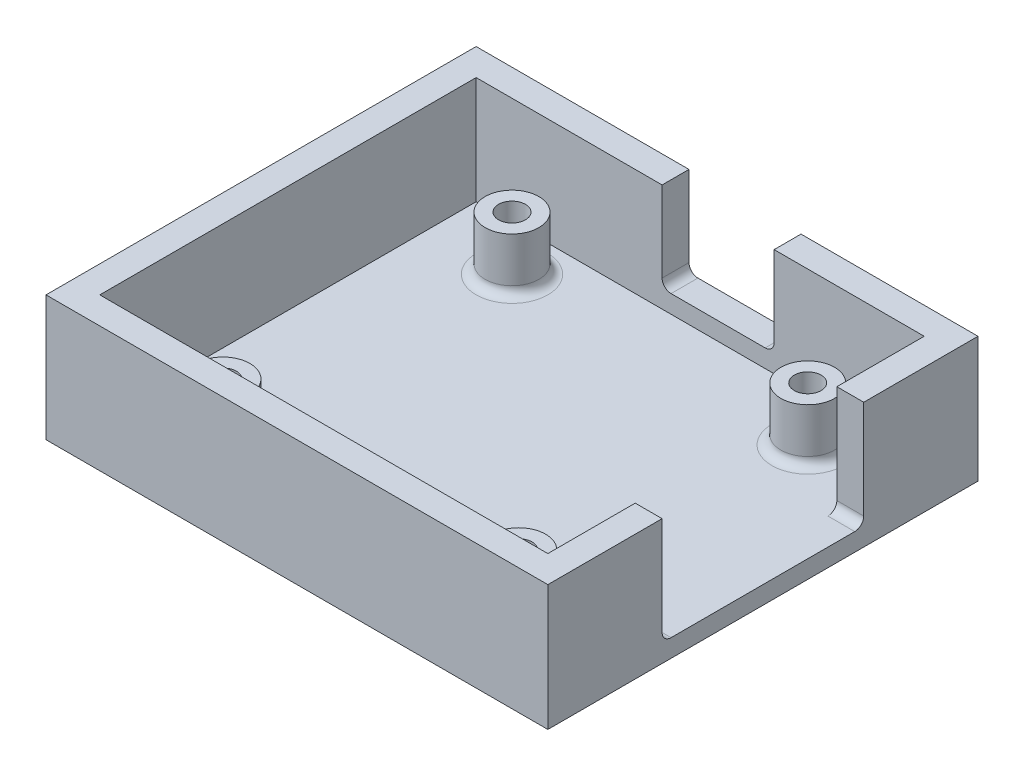
ISO-10303-21;
HEADER;
FILE_DESCRIPTION(('STEP AP214'),'2;1');
FILE_NAME('part.step','',(''),(''),'','','');
FILE_SCHEMA(('AUTOMOTIVE_DESIGN { 1 0 10303 214 1 1 1 1 }'));
ENDSEC;
DATA;
#1=APPLICATION_CONTEXT('core data for automotive mechanical design processes');
#2=APPLICATION_PROTOCOL_DEFINITION('international standard','automotive_design',2000,#1);
#3=PRODUCT_CONTEXT('',#1,'mechanical');
#4=PRODUCT('Part','Part','',(#3));
#5=PRODUCT_RELATED_PRODUCT_CATEGORY('part','',(#4));
#6=PRODUCT_DEFINITION_FORMATION('','',#4);
#7=PRODUCT_DEFINITION_CONTEXT('part definition',#1,'design');
#8=PRODUCT_DEFINITION('design','',#6,#7);
#9=PRODUCT_DEFINITION_SHAPE('','',#8);
#10=(LENGTH_UNIT() NAMED_UNIT(*) SI_UNIT(.MILLI.,.METRE.));
#11=(NAMED_UNIT(*) PLANE_ANGLE_UNIT() SI_UNIT($,.RADIAN.));
#12=(NAMED_UNIT(*) SI_UNIT($,.STERADIAN.) SOLID_ANGLE_UNIT());
#13=UNCERTAINTY_MEASURE_WITH_UNIT(LENGTH_MEASURE(1.E-05),#10,'distance_accuracy_value','');
#14=(GEOMETRIC_REPRESENTATION_CONTEXT(3) GLOBAL_UNCERTAINTY_ASSIGNED_CONTEXT((#13)) GLOBAL_UNIT_ASSIGNED_CONTEXT((#10,
#11,#12)) REPRESENTATION_CONTEXT('',''));
#15=CARTESIAN_POINT('',(0.,0.,0.));
#16=DIRECTION('',(0.,0.,1.));
#17=DIRECTION('',(1.,0.,0.));
#18=AXIS2_PLACEMENT_3D('',#15,#16,#17);
#19=CARTESIAN_POINT('',(0.,14.,0.));
#20=DIRECTION('',(0.,1.,0.));
#21=DIRECTION('',(0.,0.,1.));
#22=AXIS2_PLACEMENT_3D('',#19,#20,#21);
#23=PLANE('',#22);
#24=DIRECTION('',(0.,0.,1.));
#25=VECTOR('',#24,1.);
#26=CARTESIAN_POINT('',(3.67964824120601,14.,-39.5002729051399));
#27=LINE('',#26,#25);
#28=CARTESIAN_POINT('',(3.67964824120601,14.,-23.4924623115578));
#29=VERTEX_POINT('',#28);
#30=CARTESIAN_POINT('',(3.67964824120601,14.,-20.4924623115578));
#31=VERTEX_POINT('',#30);
#32=EDGE_CURVE('E207',#29,#31,#27,.T.);
#33=ORIENTED_EDGE('',*,*,#32,.F.);
#34=DIRECTION('',(-1.,0.,0.));
#35=VECTOR('',#34,1.);
#36=CARTESIAN_POINT('',(-20.070351758794,14.,-23.4924623115578));
#37=LINE('',#36,#35);
#38=CARTESIAN_POINT('',(-20.070351758794,14.,-23.4924623115578));
#39=VERTEX_POINT('',#38);
#40=EDGE_CURVE('E256',#29,#39,#37,.T.);
#41=ORIENTED_EDGE('',*,*,#40,.T.);
#42=DIRECTION('',(0.,0.,1.));
#43=VECTOR('',#42,1.);
#44=CARTESIAN_POINT('',(-20.070351758794,14.,-23.4924623115578));
#45=LINE('',#44,#43);
#46=CARTESIAN_POINT('',(-20.070351758794,14.,24.5075376884422));
#47=VERTEX_POINT('',#46);
#48=EDGE_CURVE('E243',#39,#47,#45,.T.);
#49=ORIENTED_EDGE('',*,*,#48,.T.);
#50=DIRECTION('',(1.,0.,0.));
#51=VECTOR('',#50,1.);
#52=CARTESIAN_POINT('',(-20.070351758794,14.,24.5075376884422));
#53=LINE('',#52,#51);
#54=CARTESIAN_POINT('',(35.929648241206,14.,24.5075376884422));
#55=VERTEX_POINT('',#54);
#56=EDGE_CURVE('E247',#47,#55,#53,.T.);
#57=ORIENTED_EDGE('',*,*,#56,.T.);
#58=DIRECTION('',(0.,0.,-1.));
#59=VECTOR('',#58,1.);
#60=CARTESIAN_POINT('',(35.929648241206,14.,-23.4924623115578));
#61=LINE('',#60,#59);
#62=CARTESIAN_POINT('',(35.929648241206,14.,11.7575376884422));
#63=VERTEX_POINT('',#62);
#64=EDGE_CURVE('E252',#55,#63,#61,.T.);
#65=ORIENTED_EDGE('',*,*,#64,.T.);
#66=DIRECTION('',(-1.,0.,0.));
#67=VECTOR('',#66,1.);
#68=CARTESIAN_POINT('',(61.429648241206,14.,11.7575376884422));
#69=LINE('',#68,#67);
#70=CARTESIAN_POINT('',(32.929648241206,14.,11.7575376884422));
#71=VERTEX_POINT('',#70);
#72=EDGE_CURVE('E503',#63,#71,#69,.T.);
#73=ORIENTED_EDGE('',*,*,#72,.T.);
#74=DIRECTION('',(0.,0.,-1.));
#75=VECTOR('',#74,1.);
#76=CARTESIAN_POINT('',(32.929648241206,14.,-20.4924623115578));
#77=LINE('',#76,#75);
#78=CARTESIAN_POINT('',(32.929648241206,14.,21.5075376884422));
#79=VERTEX_POINT('',#78);
#80=EDGE_CURVE('E224',#79,#71,#77,.T.);
#81=ORIENTED_EDGE('',*,*,#80,.F.);
#82=DIRECTION('',(1.,0.,0.));
#83=VECTOR('',#82,1.);
#84=CARTESIAN_POINT('',(-17.070351758794,14.,21.5075376884422));
#85=LINE('',#84,#83);
#86=CARTESIAN_POINT('',(-17.070351758794,14.,21.5075376884422));
#87=VERTEX_POINT('',#86);
#88=EDGE_CURVE('E471',#87,#79,#85,.T.);
#89=ORIENTED_EDGE('',*,*,#88,.F.);
#90=DIRECTION('',(0.,0.,1.));
#91=VECTOR('',#90,1.);
#92=CARTESIAN_POINT('',(-17.070351758794,14.,-20.4924623115578));
#93=LINE('',#92,#91);
#94=CARTESIAN_POINT('',(-17.070351758794,14.,-20.4924623115578));
#95=VERTEX_POINT('',#94);
#96=EDGE_CURVE('E466',#95,#87,#93,.T.);
#97=ORIENTED_EDGE('',*,*,#96,.F.);
#98=DIRECTION('',(-1.,0.,0.));
#99=VECTOR('',#98,1.);
#100=CARTESIAN_POINT('',(-17.070351758794,14.,-20.4924623115578));
#101=LINE('',#100,#99);
#102=EDGE_CURVE('E217',#31,#95,#101,.T.);
#103=ORIENTED_EDGE('',*,*,#102,.F.);
#104=EDGE_LOOP('',(#33,#41,#49,#57,#65,#73,#81,#89,#97,#103));
#105=FACE_BOUND('',#104,.T.);
#106=ADVANCED_FACE('F43',(#105),#23,.T.);
#107=CARTESIAN_POINT('',(32.929648241206,2.,-20.4924623115578));
#108=DIRECTION('',(1.,0.,0.));
#109=DIRECTION('',(0.,0.,-1.));
#110=AXIS2_PLACEMENT_3D('',#107,#108,#109);
#111=PLANE('',#110);
#112=DIRECTION('',(0.,0.,-1.));
#113=VECTOR('',#112,1.);
#114=CARTESIAN_POINT('',(32.929648241206,2.,-20.4924623115578));
#115=LINE('',#114,#113);
#116=CARTESIAN_POINT('',(32.929648241206,2.,-9.74246231155779));
#117=VERTEX_POINT('',#116);
#118=CARTESIAN_POINT('',(32.929648241206,2.,-20.4924623115578));
#119=VERTEX_POINT('',#118);
#120=EDGE_CURVE('E481',#117,#119,#115,.T.);
#121=ORIENTED_EDGE('',*,*,#120,.F.);
#122=CARTESIAN_POINT('',(32.929648241206,3.,-9.74246231155779));
#123=DIRECTION('',(1.,0.,0.));
#124=DIRECTION('',(0.,0.,-1.));
#125=AXIS2_PLACEMENT_3D('',#122,#123,#124);
#126=CIRCLE('',#125,1.);
#127=CARTESIAN_POINT('',(32.929648241206,3.,-10.7424623115578));
#128=VERTEX_POINT('',#127);
#129=EDGE_CURVE('E339',#117,#128,#126,.T.);
#130=ORIENTED_EDGE('',*,*,#129,.T.);
#131=DIRECTION('',(0.,-1.,0.));
#132=VECTOR('',#131,1.);
#133=CARTESIAN_POINT('',(32.929648241206,14.,-10.7424623115578));
#134=LINE('',#133,#132);
#135=CARTESIAN_POINT('',(32.929648241206,14.,-10.7424623115578));
#136=VERTEX_POINT('',#135);
#137=EDGE_CURVE('E513',#136,#128,#134,.T.);
#138=ORIENTED_EDGE('',*,*,#137,.F.);
#139=CARTESIAN_POINT('',(32.929648241206,14.,-20.4924623115578));
#140=VERTEX_POINT('',#139);
#141=EDGE_CURVE('E489',#136,#140,#77,.T.);
#142=ORIENTED_EDGE('',*,*,#141,.T.);
#143=DIRECTION('',(0.,1.,0.));
#144=VECTOR('',#143,1.);
#145=CARTESIAN_POINT('',(32.929648241206,2.,-20.4924623115578));
#146=LINE('',#145,#144);
#147=EDGE_CURVE('E214',#119,#140,#146,.T.);
#148=ORIENTED_EDGE('',*,*,#147,.F.);
#149=EDGE_LOOP('',(#121,#130,#138,#142,#148));
#150=FACE_BOUND('',#149,.T.);
#151=ADVANCED_FACE('F393',(#150),#111,.F.);
#152=CARTESIAN_POINT('',(-20.070351758794,14.,-23.4924623115578));
#153=DIRECTION('',(1.,0.,0.));
#154=DIRECTION('',(0.,0.,-1.));
#155=AXIS2_PLACEMENT_3D('',#152,#153,#154);
#156=PLANE('',#155);
#157=DIRECTION('',(0.,0.,1.));
#158=VECTOR('',#157,1.);
#159=CARTESIAN_POINT('',(-20.070351758794,0.,-23.4924623115578));
#160=LINE('',#159,#158);
#161=CARTESIAN_POINT('',(-20.070351758794,0.,-23.4924623115578));
#162=VERTEX_POINT('',#161);
#163=CARTESIAN_POINT('',(-20.070351758794,0.,24.5075376884422));
#164=VERTEX_POINT('',#163);
#165=EDGE_CURVE('E232',#162,#164,#160,.T.);
#166=ORIENTED_EDGE('',*,*,#165,.T.);
#167=DIRECTION('',(0.,-1.,0.));
#168=VECTOR('',#167,1.);
#169=CARTESIAN_POINT('',(-20.070351758794,14.,24.5075376884422));
#170=LINE('',#169,#168);
#171=EDGE_CURVE('E282',#47,#164,#170,.T.);
#172=ORIENTED_EDGE('',*,*,#171,.F.);
#173=ORIENTED_EDGE('',*,*,#48,.F.);
#174=DIRECTION('',(0.,-1.,0.));
#175=VECTOR('',#174,1.);
#176=CARTESIAN_POINT('',(-20.070351758794,14.,-23.4924623115578));
#177=LINE('',#176,#175);
#178=EDGE_CURVE('E259',#39,#162,#177,.T.);
#179=ORIENTED_EDGE('',*,*,#178,.T.);
#180=EDGE_LOOP('',(#166,#172,#173,#179));
#181=FACE_BOUND('',#180,.T.);
#182=ADVANCED_FACE('F399',(#181),#156,.F.);
#183=CARTESIAN_POINT('',(-20.070351758794,14.,24.5075376884422));
#184=DIRECTION('',(0.,0.,-1.));
#185=DIRECTION('',(-1.,0.,0.));
#186=AXIS2_PLACEMENT_3D('',#183,#184,#185);
#187=PLANE('',#186);
#188=DIRECTION('',(1.,0.,0.));
#189=VECTOR('',#188,1.);
#190=CARTESIAN_POINT('',(-20.070351758794,0.,24.5075376884422));
#191=LINE('',#190,#189);
#192=CARTESIAN_POINT('',(35.929648241206,0.,24.5075376884422));
#193=VERTEX_POINT('',#192);
#194=EDGE_CURVE('E263',#164,#193,#191,.T.);
#195=ORIENTED_EDGE('',*,*,#194,.T.);
#196=DIRECTION('',(0.,-1.,0.));
#197=VECTOR('',#196,1.);
#198=CARTESIAN_POINT('',(35.929648241206,14.,24.5075376884422));
#199=LINE('',#198,#197);
#200=EDGE_CURVE('E278',#55,#193,#199,.T.);
#201=ORIENTED_EDGE('',*,*,#200,.F.);
#202=ORIENTED_EDGE('',*,*,#56,.F.);
#203=ORIENTED_EDGE('',*,*,#171,.T.);
#204=EDGE_LOOP('',(#195,#201,#202,#203));
#205=FACE_BOUND('',#204,.T.);
#206=ADVANCED_FACE('F421',(#205),#187,.F.);
#207=CARTESIAN_POINT('',(35.929648241206,14.,-23.4924623115578));
#208=DIRECTION('',(-1.,0.,0.));
#209=DIRECTION('',(0.,0.,1.));
#210=AXIS2_PLACEMENT_3D('',#207,#208,#209);
#211=PLANE('',#210);
#212=CARTESIAN_POINT('',(35.929648241206,14.,-10.7424623115578));
#213=VERTEX_POINT('',#212);
#214=CARTESIAN_POINT('',(35.929648241206,14.,-23.4924623115578));
#215=VERTEX_POINT('',#214);
#216=EDGE_CURVE('E251',#213,#215,#61,.T.);
#217=ORIENTED_EDGE('',*,*,#216,.F.);
#218=DIRECTION('',(0.,1.,0.));
#219=VECTOR('',#218,1.);
#220=CARTESIAN_POINT('',(35.929648241206,14.,-10.7424623115578));
#221=LINE('',#220,#219);
#222=CARTESIAN_POINT('',(35.929648241206,3.,-10.7424623115578));
#223=VERTEX_POINT('',#222);
#224=EDGE_CURVE('E521',#223,#213,#221,.T.);
#225=ORIENTED_EDGE('',*,*,#224,.F.);
#226=CARTESIAN_POINT('',(35.929648241206,3.,-9.74246231155779));
#227=DIRECTION('',(-1.,0.,0.));
#228=DIRECTION('',(0.,0.,1.));
#229=AXIS2_PLACEMENT_3D('',#226,#227,#228);
#230=CIRCLE('',#229,1.);
#231=CARTESIAN_POINT('',(35.929648241206,2.,-9.74246231155779));
#232=VERTEX_POINT('',#231);
#233=EDGE_CURVE('E342',#223,#232,#230,.T.);
#234=ORIENTED_EDGE('',*,*,#233,.T.);
#235=DIRECTION('',(0.,0.,-1.));
#236=VECTOR('',#235,1.);
#237=CARTESIAN_POINT('',(35.929648241206,2.,-10.7424623115578));
#238=LINE('',#237,#236);
#239=CARTESIAN_POINT('',(35.929648241206,2.,10.7575376884422));
#240=VERTEX_POINT('',#239);
#241=EDGE_CURVE('E516',#240,#232,#238,.T.);
#242=ORIENTED_EDGE('',*,*,#241,.F.);
#243=CARTESIAN_POINT('',(35.929648241206,3.,10.7575376884422));
#244=DIRECTION('',(-1.,0.,0.));
#245=DIRECTION('',(0.,0.,1.));
#246=AXIS2_PLACEMENT_3D('',#243,#244,#245);
#247=CIRCLE('',#246,1.);
#248=CARTESIAN_POINT('',(35.929648241206,3.,11.7575376884422));
#249=VERTEX_POINT('',#248);
#250=EDGE_CURVE('E67',#240,#249,#247,.T.);
#251=ORIENTED_EDGE('',*,*,#250,.T.);
#252=DIRECTION('',(0.,-1.,0.));
#253=VECTOR('',#252,1.);
#254=CARTESIAN_POINT('',(35.929648241206,14.,11.7575376884422));
#255=LINE('',#254,#253);
#256=EDGE_CURVE('E511',#63,#249,#255,.T.);
#257=ORIENTED_EDGE('',*,*,#256,.F.);
#258=ORIENTED_EDGE('',*,*,#64,.F.);
#259=ORIENTED_EDGE('',*,*,#200,.T.);
#260=DIRECTION('',(0.,0.,-1.));
#261=VECTOR('',#260,1.);
#262=CARTESIAN_POINT('',(35.929648241206,0.,-23.4924623115578));
#263=LINE('',#262,#261);
#264=CARTESIAN_POINT('',(35.929648241206,0.,-23.4924623115578));
#265=VERTEX_POINT('',#264);
#266=EDGE_CURVE('E266',#193,#265,#263,.T.);
#267=ORIENTED_EDGE('',*,*,#266,.T.);
#268=DIRECTION('',(0.,-1.,0.));
#269=VECTOR('',#268,1.);
#270=CARTESIAN_POINT('',(35.929648241206,14.,-23.4924623115578));
#271=LINE('',#270,#269);
#272=EDGE_CURVE('E274',#215,#265,#271,.T.);
#273=ORIENTED_EDGE('',*,*,#272,.F.);
#274=EDGE_LOOP('',(#217,#225,#234,#242,#251,#257,#258,#259,#267,#273));
#275=FACE_BOUND('',#274,.T.);
#276=ADVANCED_FACE('F415',(#275),#211,.F.);
#277=CARTESIAN_POINT('',(-20.070351758794,14.,-23.4924623115578));
#278=DIRECTION('',(0.,0.,1.));
#279=DIRECTION('',(1.,0.,0.));
#280=AXIS2_PLACEMENT_3D('',#277,#278,#279);
#281=PLANE('',#280);
#282=ORIENTED_EDGE('',*,*,#40,.F.);
#283=DIRECTION('',(0.,1.,0.));
#284=VECTOR('',#283,1.);
#285=CARTESIAN_POINT('',(3.67964824120601,14.,-23.4924623115578));
#286=LINE('',#285,#284);
#287=CARTESIAN_POINT('',(3.67964824120601,5.,-23.4924623115578));
#288=VERTEX_POINT('',#287);
#289=EDGE_CURVE('E594',#288,#29,#286,.T.);
#290=ORIENTED_EDGE('',*,*,#289,.F.);
#291=CARTESIAN_POINT('',(4.67964824120601,5.,-23.4924623115578));
#292=DIRECTION('',(0.,0.,1.));
#293=DIRECTION('',(1.,0.,0.));
#294=AXIS2_PLACEMENT_3D('',#291,#292,#293);
#295=CIRCLE('',#294,1.);
#296=CARTESIAN_POINT('',(4.67964824120601,4.,-23.4924623115578));
#297=VERTEX_POINT('',#296);
#298=EDGE_CURVE('E336',#288,#297,#295,.T.);
#299=ORIENTED_EDGE('',*,*,#298,.T.);
#300=DIRECTION('',(-1.,0.,0.));
#301=VECTOR('',#300,1.);
#302=CARTESIAN_POINT('',(3.67964824120601,4.,-23.4924623115578));
#303=LINE('',#302,#301);
#304=CARTESIAN_POINT('',(15.179648241206,4.,-23.4924623115578));
#305=VERTEX_POINT('',#304);
#306=EDGE_CURVE('E611',#305,#297,#303,.T.);
#307=ORIENTED_EDGE('',*,*,#306,.F.);
#308=CARTESIAN_POINT('',(15.179648241206,5.,-23.4924623115578));
#309=DIRECTION('',(0.,0.,1.));
#310=DIRECTION('',(1.,0.,0.));
#311=AXIS2_PLACEMENT_3D('',#308,#309,#310);
#312=CIRCLE('',#311,1.);
#313=CARTESIAN_POINT('',(16.179648241206,5.,-23.4924623115578));
#314=VERTEX_POINT('',#313);
#315=EDGE_CURVE('E330',#305,#314,#312,.T.);
#316=ORIENTED_EDGE('',*,*,#315,.T.);
#317=DIRECTION('',(0.,-1.,0.));
#318=VECTOR('',#317,1.);
#319=CARTESIAN_POINT('',(16.179648241206,14.,-23.4924623115578));
#320=LINE('',#319,#318);
#321=CARTESIAN_POINT('',(16.179648241206,14.,-23.4924623115578));
#322=VERTEX_POINT('',#321);
#323=EDGE_CURVE('E591',#322,#314,#320,.T.);
#324=ORIENTED_EDGE('',*,*,#323,.F.);
#325=EDGE_CURVE('E205',#215,#322,#37,.T.);
#326=ORIENTED_EDGE('',*,*,#325,.F.);
#327=ORIENTED_EDGE('',*,*,#272,.T.);
#328=DIRECTION('',(-1.,0.,0.));
#329=VECTOR('',#328,1.);
#330=CARTESIAN_POINT('',(-20.070351758794,0.,-23.4924623115578));
#331=LINE('',#330,#329);
#332=EDGE_CURVE('E248',#265,#162,#331,.T.);
#333=ORIENTED_EDGE('',*,*,#332,.T.);
#334=ORIENTED_EDGE('',*,*,#178,.F.);
#335=EDGE_LOOP('',(#282,#290,#299,#307,#316,#324,#326,#327,#333,#334));
#336=FACE_BOUND('',#335,.T.);
#337=ADVANCED_FACE('F408',(#336),#281,.F.);
#338=DIRECTION('',(0.,0.,1.));
#339=VECTOR('',#338,1.);
#340=CARTESIAN_POINT('',(16.179648241206,14.,-39.5002729051399));
#341=LINE('',#340,#339);
#342=CARTESIAN_POINT('',(16.179648241206,14.,-20.4924623115578));
#343=VERTEX_POINT('',#342);
#344=EDGE_CURVE('E189',#322,#343,#341,.T.);
#345=ORIENTED_EDGE('',*,*,#344,.T.);
#346=EDGE_CURVE('E203',#140,#343,#101,.T.);
#347=ORIENTED_EDGE('',*,*,#346,.F.);
#348=ORIENTED_EDGE('',*,*,#141,.F.);
#349=DIRECTION('',(-1.,0.,0.));
#350=VECTOR('',#349,1.);
#351=CARTESIAN_POINT('',(61.429648241206,14.,-10.7424623115578));
#352=LINE('',#351,#350);
#353=EDGE_CURVE('E507',#213,#136,#352,.T.);
#354=ORIENTED_EDGE('',*,*,#353,.F.);
#355=ORIENTED_EDGE('',*,*,#216,.T.);
#356=ORIENTED_EDGE('',*,*,#325,.T.);
#357=EDGE_LOOP('',(#345,#347,#348,#354,#355,#356));
#358=FACE_BOUND('',#357,.T.);
#359=ADVANCED_FACE('F201',(#358),#23,.T.);
#360=CARTESIAN_POINT('',(0.,0.,0.));
#361=DIRECTION('',(0.,1.,0.));
#362=DIRECTION('',(0.,0.,1.));
#363=AXIS2_PLACEMENT_3D('',#360,#361,#362);
#364=PLANE('',#363);
#365=ORIENTED_EDGE('',*,*,#165,.F.);
#366=ORIENTED_EDGE('',*,*,#332,.F.);
#367=ORIENTED_EDGE('',*,*,#266,.F.);
#368=ORIENTED_EDGE('',*,*,#194,.F.);
#369=EDGE_LOOP('',(#365,#366,#367,#368));
#370=FACE_BOUND('',#369,.T.);
#371=ADVANCED_FACE('F407',(#370),#364,.F.);
#372=CARTESIAN_POINT('',(-17.070351758794,2.,-20.4924623115578));
#373=DIRECTION('',(-1.,0.,0.));
#374=DIRECTION('',(0.,0.,1.));
#375=AXIS2_PLACEMENT_3D('',#372,#373,#374);
#376=PLANE('',#375);
#377=ORIENTED_EDGE('',*,*,#96,.T.);
#378=DIRECTION('',(0.,1.,0.));
#379=VECTOR('',#378,1.);
#380=CARTESIAN_POINT('',(-17.070351758794,2.,21.5075376884422));
#381=LINE('',#380,#379);
#382=CARTESIAN_POINT('',(-17.070351758794,2.,21.5075376884422));
#383=VERTEX_POINT('',#382);
#384=EDGE_CURVE('E238',#383,#87,#381,.T.);
#385=ORIENTED_EDGE('',*,*,#384,.F.);
#386=DIRECTION('',(0.,0.,1.));
#387=VECTOR('',#386,1.);
#388=CARTESIAN_POINT('',(-17.070351758794,2.,-20.4924623115578));
#389=LINE('',#388,#387);
#390=CARTESIAN_POINT('',(-17.070351758794,2.,-20.4924623115578));
#391=VERTEX_POINT('',#390);
#392=EDGE_CURVE('E216',#391,#383,#389,.T.);
#393=ORIENTED_EDGE('',*,*,#392,.F.);
#394=DIRECTION('',(0.,1.,0.));
#395=VECTOR('',#394,1.);
#396=CARTESIAN_POINT('',(-17.070351758794,2.,-20.4924623115578));
#397=LINE('',#396,#395);
#398=EDGE_CURVE('E228',#391,#95,#397,.T.);
#399=ORIENTED_EDGE('',*,*,#398,.T.);
#400=EDGE_LOOP('',(#377,#385,#393,#399));
#401=FACE_BOUND('',#400,.T.);
#402=ADVANCED_FACE('F413',(#401),#376,.F.);
#403=CARTESIAN_POINT('',(-17.070351758794,2.,-20.4924623115578));
#404=DIRECTION('',(0.,0.,-1.));
#405=DIRECTION('',(-1.,0.,0.));
#406=AXIS2_PLACEMENT_3D('',#403,#404,#405);
#407=PLANE('',#406);
#408=DIRECTION('',(1.,0.,0.));
#409=VECTOR('',#408,1.);
#410=CARTESIAN_POINT('',(3.67964824120601,4.,-20.4924623115578));
#411=LINE('',#410,#409);
#412=CARTESIAN_POINT('',(4.67964824120601,4.,-20.4924623115578));
#413=VERTEX_POINT('',#412);
#414=CARTESIAN_POINT('',(15.179648241206,4.,-20.4924623115578));
#415=VERTEX_POINT('',#414);
#416=EDGE_CURVE('E196',#413,#415,#411,.T.);
#417=ORIENTED_EDGE('',*,*,#416,.F.);
#418=CARTESIAN_POINT('',(4.67964824120601,5.,-20.4924623115578));
#419=DIRECTION('',(0.,0.,-1.));
#420=DIRECTION('',(-1.,0.,0.));
#421=AXIS2_PLACEMENT_3D('',#418,#419,#420);
#422=CIRCLE('',#421,1.);
#423=CARTESIAN_POINT('',(3.67964824120601,5.,-20.4924623115578));
#424=VERTEX_POINT('',#423);
#425=EDGE_CURVE('E333',#413,#424,#422,.T.);
#426=ORIENTED_EDGE('',*,*,#425,.T.);
#427=DIRECTION('',(0.,-1.,0.));
#428=VECTOR('',#427,1.);
#429=CARTESIAN_POINT('',(3.67964824120601,14.,-20.4924623115578));
#430=LINE('',#429,#428);
#431=EDGE_CURVE('E587',#31,#424,#430,.T.);
#432=ORIENTED_EDGE('',*,*,#431,.F.);
#433=ORIENTED_EDGE('',*,*,#102,.T.);
#434=ORIENTED_EDGE('',*,*,#398,.F.);
#435=DIRECTION('',(-1.,0.,0.));
#436=VECTOR('',#435,1.);
#437=CARTESIAN_POINT('',(-17.070351758794,2.,-20.4924623115578));
#438=LINE('',#437,#436);
#439=EDGE_CURVE('E242',#119,#391,#438,.T.);
#440=ORIENTED_EDGE('',*,*,#439,.F.);
#441=ORIENTED_EDGE('',*,*,#147,.T.);
#442=ORIENTED_EDGE('',*,*,#346,.T.);
#443=DIRECTION('',(0.,1.,0.));
#444=VECTOR('',#443,1.);
#445=CARTESIAN_POINT('',(16.179648241206,14.,-20.4924623115578));
#446=LINE('',#445,#444);
#447=CARTESIAN_POINT('',(16.179648241206,5.,-20.4924623115578));
#448=VERTEX_POINT('',#447);
#449=EDGE_CURVE('E185',#448,#343,#446,.T.);
#450=ORIENTED_EDGE('',*,*,#449,.F.);
#451=CARTESIAN_POINT('',(15.179648241206,5.,-20.4924623115578));
#452=DIRECTION('',(0.,0.,-1.));
#453=DIRECTION('',(-1.,0.,0.));
#454=AXIS2_PLACEMENT_3D('',#451,#452,#453);
#455=CIRCLE('',#454,1.);
#456=EDGE_CURVE('E327',#448,#415,#455,.T.);
#457=ORIENTED_EDGE('',*,*,#456,.T.);
#458=EDGE_LOOP('',(#417,#426,#432,#433,#434,#440,#441,#442,#450,#457));
#459=FACE_BOUND('',#458,.T.);
#460=ADVANCED_FACE('F211',(#459),#407,.F.);
#461=ORIENTED_EDGE('',*,*,#80,.T.);
#462=DIRECTION('',(0.,1.,0.));
#463=VECTOR('',#462,1.);
#464=CARTESIAN_POINT('',(32.929648241206,14.,11.7575376884422));
#465=LINE('',#464,#463);
#466=CARTESIAN_POINT('',(32.929648241206,3.,11.7575376884422));
#467=VERTEX_POINT('',#466);
#468=EDGE_CURVE('E499',#467,#71,#465,.T.);
#469=ORIENTED_EDGE('',*,*,#468,.F.);
#470=CARTESIAN_POINT('',(32.929648241206,3.,10.7575376884422));
#471=DIRECTION('',(1.,0.,0.));
#472=DIRECTION('',(0.,0.,-1.));
#473=AXIS2_PLACEMENT_3D('',#470,#471,#472);
#474=CIRCLE('',#473,1.);
#475=CARTESIAN_POINT('',(32.929648241206,2.,10.7575376884422));
#476=VERTEX_POINT('',#475);
#477=EDGE_CURVE('E59',#467,#476,#474,.T.);
#478=ORIENTED_EDGE('',*,*,#477,.T.);
#479=CARTESIAN_POINT('',(32.929648241206,2.,21.5075376884422));
#480=VERTEX_POINT('',#479);
#481=EDGE_CURVE('E482',#480,#476,#115,.T.);
#482=ORIENTED_EDGE('',*,*,#481,.F.);
#483=DIRECTION('',(0.,1.,0.));
#484=VECTOR('',#483,1.);
#485=CARTESIAN_POINT('',(32.929648241206,2.,21.5075376884422));
#486=LINE('',#485,#484);
#487=EDGE_CURVE('E235',#480,#79,#486,.T.);
#488=ORIENTED_EDGE('',*,*,#487,.T.);
#489=EDGE_LOOP('',(#461,#469,#478,#482,#488));
#490=FACE_BOUND('',#489,.T.);
#491=ADVANCED_FACE('F402',(#490),#111,.F.);
#492=CARTESIAN_POINT('',(-17.070351758794,2.,21.5075376884422));
#493=DIRECTION('',(0.,0.,1.));
#494=DIRECTION('',(1.,0.,0.));
#495=AXIS2_PLACEMENT_3D('',#492,#493,#494);
#496=PLANE('',#495);
#497=ORIENTED_EDGE('',*,*,#88,.T.);
#498=ORIENTED_EDGE('',*,*,#487,.F.);
#499=DIRECTION('',(1.,0.,0.));
#500=VECTOR('',#499,1.);
#501=CARTESIAN_POINT('',(-17.070351758794,2.,21.5075376884422));
#502=LINE('',#501,#500);
#503=EDGE_CURVE('E222',#383,#480,#502,.T.);
#504=ORIENTED_EDGE('',*,*,#503,.F.);
#505=ORIENTED_EDGE('',*,*,#384,.T.);
#506=EDGE_LOOP('',(#497,#498,#504,#505));
#507=FACE_BOUND('',#506,.T.);
#508=ADVANCED_FACE('F570',(#507),#496,.F.);
#509=CARTESIAN_POINT('',(0.,2.,0.));
#510=DIRECTION('',(0.,1.,0.));
#511=DIRECTION('',(0.,0.,1.));
#512=AXIS2_PLACEMENT_3D('',#509,#510,#511);
#513=PLANE('',#512);
#514=CARTESIAN_POINT('',(-8.07035175879399,2.,-15.4924623115578));
#515=DIRECTION('',(0.,1.,0.));
#516=DIRECTION('',(0.,0.,1.));
#517=AXIS2_PLACEMENT_3D('',#514,#515,#516);
#518=CIRCLE('',#517,4.);
#519=CARTESIAN_POINT('',(-8.07035175879399,2.,-11.4924623115578));
#520=VERTEX_POINT('',#519);
#521=EDGE_CURVE('E365',#520,#520,#518,.F.);
#522=ORIENTED_EDGE('',*,*,#521,.T.);
#523=EDGE_LOOP('',(#522));
#524=FACE_BOUND('',#523,.T.);
#525=CARTESIAN_POINT('',(24.929648241206,2.,-15.4924623115578));
#526=DIRECTION('',(0.,1.,0.));
#527=DIRECTION('',(0.,0.,1.));
#528=AXIS2_PLACEMENT_3D('',#525,#526,#527);
#529=CIRCLE('',#528,4.);
#530=CARTESIAN_POINT('',(24.929648241206,2.,-11.4924623115578));
#531=VERTEX_POINT('',#530);
#532=EDGE_CURVE('E361',#531,#531,#529,.F.);
#533=ORIENTED_EDGE('',*,*,#532,.T.);
#534=EDGE_LOOP('',(#533));
#535=FACE_BOUND('',#534,.T.);
#536=CARTESIAN_POINT('',(-8.07035175879399,2.,16.7575376884422));
#537=DIRECTION('',(0.,1.,0.));
#538=DIRECTION('',(0.,0.,1.));
#539=AXIS2_PLACEMENT_3D('',#536,#537,#538);
#540=CIRCLE('',#539,4.00000000000001);
#541=CARTESIAN_POINT('',(-8.07035175879399,2.,20.7575376884422));
#542=VERTEX_POINT('',#541);
#543=EDGE_CURVE('E357',#542,#542,#540,.F.);
#544=ORIENTED_EDGE('',*,*,#543,.T.);
#545=EDGE_LOOP('',(#544));
#546=FACE_BOUND('',#545,.T.);
#547=CARTESIAN_POINT('',(24.929648241206,2.,16.7575376884422));
#548=DIRECTION('',(0.,1.,0.));
#549=DIRECTION('',(0.,0.,1.));
#550=AXIS2_PLACEMENT_3D('',#547,#548,#549);
#551=CIRCLE('',#550,4.00000000000001);
#552=CARTESIAN_POINT('',(24.929648241206,2.,20.7575376884422));
#553=VERTEX_POINT('',#552);
#554=EDGE_CURVE('E353',#553,#553,#551,.F.);
#555=ORIENTED_EDGE('',*,*,#554,.T.);
#556=EDGE_LOOP('',(#555));
#557=FACE_BOUND('',#556,.T.);
#558=ORIENTED_EDGE('',*,*,#241,.T.);
#559=DIRECTION('',(-1.,0.,0.));
#560=VECTOR('',#559,1.);
#561=CARTESIAN_POINT('',(0.,2.,-9.74246231155779));
#562=LINE('',#561,#560);
#563=EDGE_CURVE('E317',#232,#117,#562,.T.);
#564=ORIENTED_EDGE('',*,*,#563,.T.);
#565=ORIENTED_EDGE('',*,*,#120,.T.);
#566=ORIENTED_EDGE('',*,*,#439,.T.);
#567=ORIENTED_EDGE('',*,*,#392,.T.);
#568=ORIENTED_EDGE('',*,*,#503,.T.);
#569=ORIENTED_EDGE('',*,*,#481,.T.);
#570=DIRECTION('',(-1.,0.,0.));
#571=VECTOR('',#570,1.);
#572=CARTESIAN_POINT('',(0.,2.,10.7575376884422));
#573=LINE('',#572,#571);
#574=EDGE_CURVE('E314',#476,#240,#573,.F.);
#575=ORIENTED_EDGE('',*,*,#574,.T.);
#576=EDGE_LOOP('',(#558,#564,#565,#566,#567,#568,#569,#575));
#577=FACE_BOUND('',#576,.T.);
#578=ADVANCED_FACE('F566',(#524,#535,#546,#557,#577),#513,.T.);
#579=CARTESIAN_POINT('',(-8.07035175879399,8.,-15.4924623115578));
#580=DIRECTION('',(0.,1.,0.));
#581=DIRECTION('',(0.,0.,1.));
#582=AXIS2_PLACEMENT_3D('',#579,#580,#581);
#583=PLANE('',#582);
#584=CARTESIAN_POINT('',(-8.07035175879399,8.,-15.4924623115578));
#585=DIRECTION('',(0.,1.,0.));
#586=DIRECTION('',(0.,0.,1.));
#587=AXIS2_PLACEMENT_3D('',#584,#585,#586);
#588=CIRCLE('',#587,3.);
#589=CARTESIAN_POINT('',(-8.07035175879399,8.,-12.4924623115578));
#590=VERTEX_POINT('',#589);
#591=EDGE_CURVE('E463',#590,#590,#588,.T.);
#592=ORIENTED_EDGE('',*,*,#591,.T.);
#593=EDGE_LOOP('',(#592));
#594=FACE_BOUND('',#593,.T.);
#595=CARTESIAN_POINT('',(-8.07035175879399,8.,-15.4924623115578));
#596=DIRECTION('',(0.,1.,0.));
#597=DIRECTION('',(0.,0.,1.));
#598=AXIS2_PLACEMENT_3D('',#595,#596,#597);
#599=CIRCLE('',#598,1.5);
#600=CARTESIAN_POINT('',(-8.07035175879399,8.,-13.9924623115578));
#601=VERTEX_POINT('',#600);
#602=EDGE_CURVE('E467',#601,#601,#599,.T.);
#603=ORIENTED_EDGE('',*,*,#602,.F.);
#604=EDGE_LOOP('',(#603));
#605=FACE_BOUND('',#604,.T.);
#606=ADVANCED_FACE('F459',(#594,#605),#583,.T.);
#607=CARTESIAN_POINT('',(-8.07035175879399,8.,-15.4924623115578));
#608=DIRECTION('',(0.,-1.,0.));
#609=DIRECTION('',(0.,0.,-1.));
#610=AXIS2_PLACEMENT_3D('',#607,#608,#609);
#611=CYLINDRICAL_SURFACE('',#610,3.);
#612=CARTESIAN_POINT('',(-8.07035175879399,3.,-15.4924623115578));
#613=DIRECTION('',(0.,1.,0.));
#614=DIRECTION('',(0.,0.,1.));
#615=AXIS2_PLACEMENT_3D('',#612,#613,#614);
#616=CIRCLE('',#615,3.);
#617=CARTESIAN_POINT('',(-8.07035175879399,3.,-12.4924623115578));
#618=VERTEX_POINT('',#617);
#619=EDGE_CURVE('E349',#618,#618,#616,.T.);
#620=ORIENTED_EDGE('',*,*,#619,.T.);
#621=EDGE_LOOP('',(#620));
#622=FACE_BOUND('',#621,.T.);
#623=ORIENTED_EDGE('',*,*,#591,.F.);
#624=EDGE_LOOP('',(#623));
#625=FACE_BOUND('',#624,.T.);
#626=ADVANCED_FACE('F455',(#622,#625),#611,.T.);
#627=CARTESIAN_POINT('',(-8.07035175879399,8.,-15.4924623115578));
#628=DIRECTION('',(0.,-1.,0.));
#629=DIRECTION('',(0.,0.,-1.));
#630=AXIS2_PLACEMENT_3D('',#627,#628,#629);
#631=CYLINDRICAL_SURFACE('',#630,1.5);
#632=ORIENTED_EDGE('',*,*,#602,.T.);
#633=EDGE_LOOP('',(#632));
#634=FACE_BOUND('',#633,.T.);
#635=CARTESIAN_POINT('',(-8.07035175879399,2.,-15.4924623115578));
#636=DIRECTION('',(0.,1.,0.));
#637=DIRECTION('',(0.,0.,1.));
#638=AXIS2_PLACEMENT_3D('',#635,#636,#637);
#639=CIRCLE('',#638,1.5);
#640=CARTESIAN_POINT('',(-8.07035175879399,2.,-13.9924623115578));
#641=VERTEX_POINT('',#640);
#642=EDGE_CURVE('E286',#641,#641,#639,.F.);
#643=ORIENTED_EDGE('',*,*,#642,.T.);
#644=EDGE_LOOP('',(#643));
#645=FACE_BOUND('',#644,.T.);
#646=ADVANCED_FACE('F458',(#634,#645),#631,.F.);
#647=ORIENTED_EDGE('',*,*,#642,.F.);
#648=EDGE_LOOP('',(#647));
#649=FACE_BOUND('',#648,.T.);
#650=ADVANCED_FACE('F559',(#649),#513,.T.);
#651=CARTESIAN_POINT('',(24.929648241206,8.,-15.4924623115578));
#652=DIRECTION('',(0.,1.,0.));
#653=DIRECTION('',(0.,0.,1.));
#654=AXIS2_PLACEMENT_3D('',#651,#652,#653);
#655=PLANE('',#654);
#656=CARTESIAN_POINT('',(24.929648241206,8.,-15.4924623115578));
#657=DIRECTION('',(0.,1.,0.));
#658=DIRECTION('',(0.,0.,1.));
#659=AXIS2_PLACEMENT_3D('',#656,#657,#658);
#660=CIRCLE('',#659,3.);
#661=CARTESIAN_POINT('',(24.929648241206,8.,-12.4924623115578));
#662=VERTEX_POINT('',#661);
#663=EDGE_CURVE('E474',#662,#662,#660,.T.);
#664=ORIENTED_EDGE('',*,*,#663,.T.);
#665=EDGE_LOOP('',(#664));
#666=FACE_BOUND('',#665,.T.);
#667=CARTESIAN_POINT('',(24.929648241206,8.,-15.4924623115578));
#668=DIRECTION('',(0.,1.,0.));
#669=DIRECTION('',(0.,0.,1.));
#670=AXIS2_PLACEMENT_3D('',#667,#668,#669);
#671=CIRCLE('',#670,1.5);
#672=CARTESIAN_POINT('',(24.929648241206,8.,-13.9924623115578));
#673=VERTEX_POINT('',#672);
#674=EDGE_CURVE('E537',#673,#673,#671,.T.);
#675=ORIENTED_EDGE('',*,*,#674,.F.);
#676=EDGE_LOOP('',(#675));
#677=FACE_BOUND('',#676,.T.);
#678=ADVANCED_FACE('F544',(#666,#677),#655,.T.);
#679=CARTESIAN_POINT('',(24.929648241206,8.,-15.4924623115578));
#680=DIRECTION('',(0.,-1.,0.));
#681=DIRECTION('',(0.,0.,-1.));
#682=AXIS2_PLACEMENT_3D('',#679,#680,#681);
#683=CYLINDRICAL_SURFACE('',#682,3.);
#684=CARTESIAN_POINT('',(24.929648241206,3.,-15.4924623115578));
#685=DIRECTION('',(0.,1.,0.));
#686=DIRECTION('',(0.,0.,1.));
#687=AXIS2_PLACEMENT_3D('',#684,#685,#686);
#688=CIRCLE('',#687,3.);
#689=CARTESIAN_POINT('',(24.929648241206,3.,-12.4924623115578));
#690=VERTEX_POINT('',#689);
#691=EDGE_CURVE('E369',#690,#690,#688,.T.);
#692=ORIENTED_EDGE('',*,*,#691,.T.);
#693=EDGE_LOOP('',(#692));
#694=FACE_BOUND('',#693,.T.);
#695=ORIENTED_EDGE('',*,*,#663,.F.);
#696=EDGE_LOOP('',(#695));
#697=FACE_BOUND('',#696,.T.);
#698=ADVANCED_FACE('F547',(#694,#697),#683,.T.);
#699=CARTESIAN_POINT('',(24.929648241206,8.,-15.4924623115578));
#700=DIRECTION('',(0.,-1.,0.));
#701=DIRECTION('',(0.,0.,-1.));
#702=AXIS2_PLACEMENT_3D('',#699,#700,#701);
#703=CYLINDRICAL_SURFACE('',#702,1.5);
#704=ORIENTED_EDGE('',*,*,#674,.T.);
#705=EDGE_LOOP('',(#704));
#706=FACE_BOUND('',#705,.T.);
#707=CARTESIAN_POINT('',(24.929648241206,2.,-15.4924623115578));
#708=DIRECTION('',(0.,1.,0.));
#709=DIRECTION('',(0.,0.,1.));
#710=AXIS2_PLACEMENT_3D('',#707,#708,#709);
#711=CIRCLE('',#710,1.5);
#712=CARTESIAN_POINT('',(24.929648241206,2.,-13.9924623115578));
#713=VERTEX_POINT('',#712);
#714=EDGE_CURVE('E290',#713,#713,#711,.F.);
#715=ORIENTED_EDGE('',*,*,#714,.T.);
#716=EDGE_LOOP('',(#715));
#717=FACE_BOUND('',#716,.T.);
#718=ADVANCED_FACE('F549',(#706,#717),#703,.F.);
#719=ORIENTED_EDGE('',*,*,#714,.F.);
#720=EDGE_LOOP('',(#719));
#721=FACE_BOUND('',#720,.T.);
#722=ADVANCED_FACE('F556',(#721),#513,.T.);
#723=CARTESIAN_POINT('',(24.929648241206,8.,16.7575376884422));
#724=DIRECTION('',(0.,1.,0.));
#725=DIRECTION('',(0.,0.,1.));
#726=AXIS2_PLACEMENT_3D('',#723,#724,#725);
#727=PLANE('',#726);
#728=CARTESIAN_POINT('',(24.929648241206,8.,16.7575376884422));
#729=DIRECTION('',(0.,1.,0.));
#730=DIRECTION('',(0.,0.,1.));
#731=AXIS2_PLACEMENT_3D('',#728,#729,#730);
#732=CIRCLE('',#731,3.00000000000001);
#733=CARTESIAN_POINT('',(24.929648241206,8.,19.7575376884422));
#734=VERTEX_POINT('',#733);
#735=EDGE_CURVE('E533',#734,#734,#732,.T.);
#736=ORIENTED_EDGE('',*,*,#735,.T.);
#737=EDGE_LOOP('',(#736));
#738=FACE_BOUND('',#737,.T.);
#739=CARTESIAN_POINT('',(24.929648241206,8.,16.7575376884422));
#740=DIRECTION('',(0.,1.,0.));
#741=DIRECTION('',(0.,0.,1.));
#742=AXIS2_PLACEMENT_3D('',#739,#740,#741);
#743=CIRCLE('',#742,1.5);
#744=CARTESIAN_POINT('',(24.929648241206,8.,18.2575376884422));
#745=VERTEX_POINT('',#744);
#746=EDGE_CURVE('E529',#745,#745,#743,.T.);
#747=ORIENTED_EDGE('',*,*,#746,.F.);
#748=EDGE_LOOP('',(#747));
#749=FACE_BOUND('',#748,.T.);
#750=ADVANCED_FACE('F665',(#738,#749),#727,.T.);
#751=CARTESIAN_POINT('',(24.929648241206,8.,16.7575376884422));
#752=DIRECTION('',(0.,-1.,0.));
#753=DIRECTION('',(0.,0.,-1.));
#754=AXIS2_PLACEMENT_3D('',#751,#752,#753);
#755=CYLINDRICAL_SURFACE('',#754,3.00000000000001);
#756=CARTESIAN_POINT('',(24.929648241206,3.,16.7575376884422));
#757=DIRECTION('',(0.,1.,0.));
#758=DIRECTION('',(0.,0.,1.));
#759=AXIS2_PLACEMENT_3D('',#756,#757,#758);
#760=CIRCLE('',#759,3.00000000000001);
#761=CARTESIAN_POINT('',(24.929648241206,3.,19.7575376884422));
#762=VERTEX_POINT('',#761);
#763=EDGE_CURVE('E11',#762,#762,#760,.T.);
#764=ORIENTED_EDGE('',*,*,#763,.T.);
#765=EDGE_LOOP('',(#764));
#766=FACE_BOUND('',#765,.T.);
#767=ORIENTED_EDGE('',*,*,#735,.F.);
#768=EDGE_LOOP('',(#767));
#769=FACE_BOUND('',#768,.T.);
#770=ADVANCED_FACE('F663',(#766,#769),#755,.T.);
#771=CARTESIAN_POINT('',(24.929648241206,8.,16.7575376884422));
#772=DIRECTION('',(0.,-1.,0.));
#773=DIRECTION('',(0.,0.,-1.));
#774=AXIS2_PLACEMENT_3D('',#771,#772,#773);
#775=CYLINDRICAL_SURFACE('',#774,1.5);
#776=ORIENTED_EDGE('',*,*,#746,.T.);
#777=EDGE_LOOP('',(#776));
#778=FACE_BOUND('',#777,.T.);
#779=CARTESIAN_POINT('',(24.929648241206,2.,16.7575376884422));
#780=DIRECTION('',(0.,1.,0.));
#781=DIRECTION('',(0.,0.,1.));
#782=AXIS2_PLACEMENT_3D('',#779,#780,#781);
#783=CIRCLE('',#782,1.5);
#784=CARTESIAN_POINT('',(24.929648241206,2.,18.2575376884422));
#785=VERTEX_POINT('',#784);
#786=EDGE_CURVE('E294',#785,#785,#783,.F.);
#787=ORIENTED_EDGE('',*,*,#786,.T.);
#788=EDGE_LOOP('',(#787));
#789=FACE_BOUND('',#788,.T.);
#790=ADVANCED_FACE('F660',(#778,#789),#775,.F.);
#791=ORIENTED_EDGE('',*,*,#786,.F.);
#792=EDGE_LOOP('',(#791));
#793=FACE_BOUND('',#792,.T.);
#794=ADVANCED_FACE('F656',(#793),#513,.T.);
#795=CARTESIAN_POINT('',(-8.07035175879399,8.,16.7575376884422));
#796=DIRECTION('',(0.,1.,0.));
#797=DIRECTION('',(0.,0.,1.));
#798=AXIS2_PLACEMENT_3D('',#795,#796,#797);
#799=PLANE('',#798);
#800=CARTESIAN_POINT('',(-8.07035175879399,8.,16.7575376884422));
#801=DIRECTION('',(0.,1.,0.));
#802=DIRECTION('',(0.,0.,1.));
#803=AXIS2_PLACEMENT_3D('',#800,#801,#802);
#804=CIRCLE('',#803,3.00000000000001);
#805=CARTESIAN_POINT('',(-8.07035175879399,8.,19.7575376884422));
#806=VERTEX_POINT('',#805);
#807=EDGE_CURVE('E525',#806,#806,#804,.T.);
#808=ORIENTED_EDGE('',*,*,#807,.T.);
#809=EDGE_LOOP('',(#808));
#810=FACE_BOUND('',#809,.T.);
#811=CARTESIAN_POINT('',(-8.07035175879399,8.,16.7575376884422));
#812=DIRECTION('',(0.,1.,0.));
#813=DIRECTION('',(0.,0.,1.));
#814=AXIS2_PLACEMENT_3D('',#811,#812,#813);
#815=CIRCLE('',#814,1.5);
#816=CARTESIAN_POINT('',(-8.07035175879399,8.,18.2575376884422));
#817=VERTEX_POINT('',#816);
#818=EDGE_CURVE('E520',#817,#817,#815,.T.);
#819=ORIENTED_EDGE('',*,*,#818,.F.);
#820=EDGE_LOOP('',(#819));
#821=FACE_BOUND('',#820,.T.);
#822=ADVANCED_FACE('F653',(#810,#821),#799,.T.);
#823=CARTESIAN_POINT('',(-8.07035175879399,8.,16.7575376884422));
#824=DIRECTION('',(0.,-1.,0.));
#825=DIRECTION('',(0.,0.,-1.));
#826=AXIS2_PLACEMENT_3D('',#823,#824,#825);
#827=CYLINDRICAL_SURFACE('',#826,3.00000000000001);
#828=CARTESIAN_POINT('',(-8.07035175879399,3.,16.7575376884422));
#829=DIRECTION('',(0.,1.,0.));
#830=DIRECTION('',(0.,0.,1.));
#831=AXIS2_PLACEMENT_3D('',#828,#829,#830);
#832=CIRCLE('',#831,3.00000000000001);
#833=CARTESIAN_POINT('',(-8.07035175879399,3.,19.7575376884422));
#834=VERTEX_POINT('',#833);
#835=EDGE_CURVE('E52',#834,#834,#832,.T.);
#836=ORIENTED_EDGE('',*,*,#835,.T.);
#837=EDGE_LOOP('',(#836));
#838=FACE_BOUND('',#837,.T.);
#839=ORIENTED_EDGE('',*,*,#807,.F.);
#840=EDGE_LOOP('',(#839));
#841=FACE_BOUND('',#840,.T.);
#842=ADVANCED_FACE('F376',(#838,#841),#827,.T.);
#843=CARTESIAN_POINT('',(-8.07035175879399,8.,16.7575376884422));
#844=DIRECTION('',(0.,-1.,0.));
#845=DIRECTION('',(0.,0.,-1.));
#846=AXIS2_PLACEMENT_3D('',#843,#844,#845);
#847=CYLINDRICAL_SURFACE('',#846,1.5);
#848=ORIENTED_EDGE('',*,*,#818,.T.);
#849=EDGE_LOOP('',(#848));
#850=FACE_BOUND('',#849,.T.);
#851=CARTESIAN_POINT('',(-8.07035175879399,2.,16.7575376884422));
#852=DIRECTION('',(0.,1.,0.));
#853=DIRECTION('',(0.,0.,1.));
#854=AXIS2_PLACEMENT_3D('',#851,#852,#853);
#855=CIRCLE('',#854,1.5);
#856=CARTESIAN_POINT('',(-8.07035175879399,2.,18.2575376884422));
#857=VERTEX_POINT('',#856);
#858=EDGE_CURVE('E298',#857,#857,#855,.F.);
#859=ORIENTED_EDGE('',*,*,#858,.T.);
#860=EDGE_LOOP('',(#859));
#861=FACE_BOUND('',#860,.T.);
#862=ADVANCED_FACE('F649',(#850,#861),#847,.F.);
#863=ORIENTED_EDGE('',*,*,#858,.F.);
#864=EDGE_LOOP('',(#863));
#865=FACE_BOUND('',#864,.T.);
#866=ADVANCED_FACE('F572',(#865),#513,.T.);
#867=CARTESIAN_POINT('',(61.429648241206,14.,-10.7424623115578));
#868=DIRECTION('',(0.,0.,-1.));
#869=DIRECTION('',(0.,1.,0.));
#870=AXIS2_PLACEMENT_3D('',#867,#868,#869);
#871=PLANE('',#870);
#872=ORIENTED_EDGE('',*,*,#137,.T.);
#873=DIRECTION('',(-1.,0.,0.));
#874=VECTOR('',#873,1.);
#875=CARTESIAN_POINT('',(61.429648241206,3.,-10.7424623115578));
#876=LINE('',#875,#874);
#877=EDGE_CURVE('E321',#128,#223,#876,.F.);
#878=ORIENTED_EDGE('',*,*,#877,.T.);
#879=ORIENTED_EDGE('',*,*,#224,.T.);
#880=ORIENTED_EDGE('',*,*,#353,.T.);
#881=EDGE_LOOP('',(#872,#878,#879,#880));
#882=FACE_BOUND('',#881,.T.);
#883=ADVANCED_FACE('F630',(#882),#871,.F.);
#884=CARTESIAN_POINT('',(61.429648241206,14.,11.7575376884422));
#885=DIRECTION('',(0.,0.,1.));
#886=DIRECTION('',(0.,-1.,0.));
#887=AXIS2_PLACEMENT_3D('',#884,#885,#886);
#888=PLANE('',#887);
#889=ORIENTED_EDGE('',*,*,#256,.T.);
#890=DIRECTION('',(-1.,0.,0.));
#891=VECTOR('',#890,1.);
#892=CARTESIAN_POINT('',(61.429648241206,3.,11.7575376884422));
#893=LINE('',#892,#891);
#894=EDGE_CURVE('E324',#249,#467,#893,.T.);
#895=ORIENTED_EDGE('',*,*,#894,.T.);
#896=ORIENTED_EDGE('',*,*,#468,.T.);
#897=ORIENTED_EDGE('',*,*,#72,.F.);
#898=EDGE_LOOP('',(#889,#895,#896,#897));
#899=FACE_BOUND('',#898,.T.);
#900=ADVANCED_FACE('F634',(#899),#888,.F.);
#901=CARTESIAN_POINT('',(3.67964824120601,14.,-39.5002729051399));
#902=DIRECTION('',(-1.,0.,0.));
#903=DIRECTION('',(0.,-1.,0.));
#904=AXIS2_PLACEMENT_3D('',#901,#902,#903);
#905=PLANE('',#904);
#906=ORIENTED_EDGE('',*,*,#431,.T.);
#907=DIRECTION('',(0.,0.,1.));
#908=VECTOR('',#907,1.);
#909=CARTESIAN_POINT('',(3.67964824120601,5.,-23.4924623115578));
#910=LINE('',#909,#908);
#911=EDGE_CURVE('E311',#424,#288,#910,.F.);
#912=ORIENTED_EDGE('',*,*,#911,.T.);
#913=ORIENTED_EDGE('',*,*,#289,.T.);
#914=ORIENTED_EDGE('',*,*,#32,.T.);
#915=EDGE_LOOP('',(#906,#912,#913,#914));
#916=FACE_BOUND('',#915,.T.);
#917=ADVANCED_FACE('F639',(#916),#905,.F.);
#918=CARTESIAN_POINT('',(16.179648241206,14.,-39.5002729051399));
#919=DIRECTION('',(1.,0.,0.));
#920=DIRECTION('',(0.,0.,-1.));
#921=AXIS2_PLACEMENT_3D('',#918,#919,#920);
#922=PLANE('',#921);
#923=ORIENTED_EDGE('',*,*,#323,.T.);
#924=DIRECTION('',(0.,0.,1.));
#925=VECTOR('',#924,1.);
#926=CARTESIAN_POINT('',(16.179648241206,5.,-20.4924623115578));
#927=LINE('',#926,#925);
#928=EDGE_CURVE('E192',#314,#448,#927,.T.);
#929=ORIENTED_EDGE('',*,*,#928,.T.);
#930=ORIENTED_EDGE('',*,*,#449,.T.);
#931=ORIENTED_EDGE('',*,*,#344,.F.);
#932=EDGE_LOOP('',(#923,#929,#930,#931));
#933=FACE_BOUND('',#932,.T.);
#934=ADVANCED_FACE('F188',(#933),#922,.F.);
#935=CARTESIAN_POINT('',(3.67964824120601,4.,-39.5002729051399));
#936=DIRECTION('',(0.,-1.,0.));
#937=DIRECTION('',(1.,0.,0.));
#938=AXIS2_PLACEMENT_3D('',#935,#936,#937);
#939=PLANE('',#938);
#940=ORIENTED_EDGE('',*,*,#416,.T.);
#941=DIRECTION('',(0.,0.,1.));
#942=VECTOR('',#941,1.);
#943=CARTESIAN_POINT('',(15.179648241206,4.,-23.4924623115578));
#944=LINE('',#943,#942);
#945=EDGE_CURVE('E308',#415,#305,#944,.F.);
#946=ORIENTED_EDGE('',*,*,#945,.T.);
#947=ORIENTED_EDGE('',*,*,#306,.T.);
#948=DIRECTION('',(0.,0.,1.));
#949=VECTOR('',#948,1.);
#950=CARTESIAN_POINT('',(4.67964824120601,4.,-20.4924623115578));
#951=LINE('',#950,#949);
#952=EDGE_CURVE('E304',#297,#413,#951,.T.);
#953=ORIENTED_EDGE('',*,*,#952,.T.);
#954=EDGE_LOOP('',(#940,#946,#947,#953));
#955=FACE_BOUND('',#954,.T.);
#956=ADVANCED_FACE('F435',(#955),#939,.F.);
#957=CARTESIAN_POINT('',(15.179648241206,5.,-39.5002729051399));
#958=DIRECTION('',(0.,0.,-1.));
#959=DIRECTION('',(-1.,0.,0.));
#960=AXIS2_PLACEMENT_3D('',#957,#958,#959);
#961=CYLINDRICAL_SURFACE('',#960,1.);
#962=ORIENTED_EDGE('',*,*,#315,.F.);
#963=ORIENTED_EDGE('',*,*,#945,.F.);
#964=ORIENTED_EDGE('',*,*,#456,.F.);
#965=ORIENTED_EDGE('',*,*,#928,.F.);
#966=EDGE_LOOP('',(#962,#963,#964,#965));
#967=FACE_BOUND('',#966,.T.);
#968=ADVANCED_FACE('F431',(#967),#961,.F.);
#969=CARTESIAN_POINT('',(4.67964824120601,5.,-39.5002729051399));
#970=DIRECTION('',(0.,0.,-1.));
#971=DIRECTION('',(-1.,0.,0.));
#972=AXIS2_PLACEMENT_3D('',#969,#970,#971);
#973=CYLINDRICAL_SURFACE('',#972,1.);
#974=ORIENTED_EDGE('',*,*,#298,.F.);
#975=ORIENTED_EDGE('',*,*,#911,.F.);
#976=ORIENTED_EDGE('',*,*,#425,.F.);
#977=ORIENTED_EDGE('',*,*,#952,.F.);
#978=EDGE_LOOP('',(#974,#975,#976,#977));
#979=FACE_BOUND('',#978,.T.);
#980=ADVANCED_FACE('F434',(#979),#973,.F.);
#981=CARTESIAN_POINT('',(0.,3.,-9.74246231155779));
#982=DIRECTION('',(-1.,0.,0.));
#983=DIRECTION('',(0.,0.,1.));
#984=AXIS2_PLACEMENT_3D('',#981,#982,#983);
#985=CYLINDRICAL_SURFACE('',#984,1.);
#986=ORIENTED_EDGE('',*,*,#233,.F.);
#987=ORIENTED_EDGE('',*,*,#877,.F.);
#988=ORIENTED_EDGE('',*,*,#129,.F.);
#989=ORIENTED_EDGE('',*,*,#563,.F.);
#990=EDGE_LOOP('',(#986,#987,#988,#989));
#991=FACE_BOUND('',#990,.T.);
#992=ADVANCED_FACE('F439',(#991),#985,.F.);
#993=CARTESIAN_POINT('',(61.429648241206,3.,10.7575376884422));
#994=DIRECTION('',(-1.,0.,0.));
#995=DIRECTION('',(0.,0.,1.));
#996=AXIS2_PLACEMENT_3D('',#993,#994,#995);
#997=CYLINDRICAL_SURFACE('',#996,1.);
#998=ORIENTED_EDGE('',*,*,#250,.F.);
#999=ORIENTED_EDGE('',*,*,#574,.F.);
#1000=ORIENTED_EDGE('',*,*,#477,.F.);
#1001=ORIENTED_EDGE('',*,*,#894,.F.);
#1002=EDGE_LOOP('',(#998,#999,#1000,#1001));
#1003=FACE_BOUND('',#1002,.T.);
#1004=ADVANCED_FACE('F443',(#1003),#997,.F.);
#1005=CARTESIAN_POINT('',(-8.07035175879399,3.,-15.4924623115578));
#1006=DIRECTION('',(0.,1.,0.));
#1007=DIRECTION('',(0.,0.,1.));
#1008=AXIS2_PLACEMENT_3D('',#1005,#1006,#1007);
#1009=TOROIDAL_SURFACE('',#1008,4.,1.);
#1010=ORIENTED_EDGE('',*,*,#521,.F.);
#1011=EDGE_LOOP('',(#1010));
#1012=FACE_BOUND('',#1011,.T.);
#1013=ORIENTED_EDGE('',*,*,#619,.F.);
#1014=EDGE_LOOP('',(#1013));
#1015=FACE_BOUND('',#1014,.T.);
#1016=ADVANCED_FACE('F388',(#1012,#1015),#1009,.F.);
#1017=CARTESIAN_POINT('',(24.929648241206,3.,-15.4924623115578));
#1018=DIRECTION('',(0.,1.,0.));
#1019=DIRECTION('',(0.,0.,1.));
#1020=AXIS2_PLACEMENT_3D('',#1017,#1018,#1019);
#1021=TOROIDAL_SURFACE('',#1020,4.,1.);
#1022=ORIENTED_EDGE('',*,*,#532,.F.);
#1023=EDGE_LOOP('',(#1022));
#1024=FACE_BOUND('',#1023,.T.);
#1025=ORIENTED_EDGE('',*,*,#691,.F.);
#1026=EDGE_LOOP('',(#1025));
#1027=FACE_BOUND('',#1026,.T.);
#1028=ADVANCED_FACE('F381',(#1024,#1027),#1021,.F.);
#1029=CARTESIAN_POINT('',(-8.07035175879399,3.,16.7575376884422));
#1030=DIRECTION('',(0.,1.,0.));
#1031=DIRECTION('',(0.,0.,1.));
#1032=AXIS2_PLACEMENT_3D('',#1029,#1030,#1031);
#1033=TOROIDAL_SURFACE('',#1032,4.00000000000001,1.);
#1034=ORIENTED_EDGE('',*,*,#543,.F.);
#1035=EDGE_LOOP('',(#1034));
#1036=FACE_BOUND('',#1035,.T.);
#1037=ORIENTED_EDGE('',*,*,#835,.F.);
#1038=EDGE_LOOP('',(#1037));
#1039=FACE_BOUND('',#1038,.T.);
#1040=ADVANCED_FACE('F379',(#1036,#1039),#1033,.F.);
#1041=CARTESIAN_POINT('',(24.929648241206,3.,16.7575376884422));
#1042=DIRECTION('',(0.,1.,0.));
#1043=DIRECTION('',(0.,0.,1.));
#1044=AXIS2_PLACEMENT_3D('',#1041,#1042,#1043);
#1045=TOROIDAL_SURFACE('',#1044,4.00000000000001,1.);
#1046=ORIENTED_EDGE('',*,*,#554,.F.);
#1047=EDGE_LOOP('',(#1046));
#1048=FACE_BOUND('',#1047,.T.);
#1049=ORIENTED_EDGE('',*,*,#763,.F.);
#1050=EDGE_LOOP('',(#1049));
#1051=FACE_BOUND('',#1050,.T.);
#1052=ADVANCED_FACE('F45',(#1048,#1051),#1045,.F.);
#1053=CLOSED_SHELL('',(#106,#151,#182,#206,#276,#337,#359,#371,#402,#460,#491,#508,#578,#606,
#626,#646,#650,#678,#698,#718,#722,#750,#770,#790,#794,#822,#842,#862,#866,#883,#900,#917,#934,
#956,#968,#980,#992,#1004,#1016,#1028,#1040,#1052));
#1054=MANIFOLD_SOLID_BREP('B2',#1053);
#1055=ADVANCED_BREP_SHAPE_REPRESENTATION('',(#18,#1054),#14);
#1056=SHAPE_DEFINITION_REPRESENTATION(#9,#1055);
ENDSEC;
END-ISO-10303-21;
